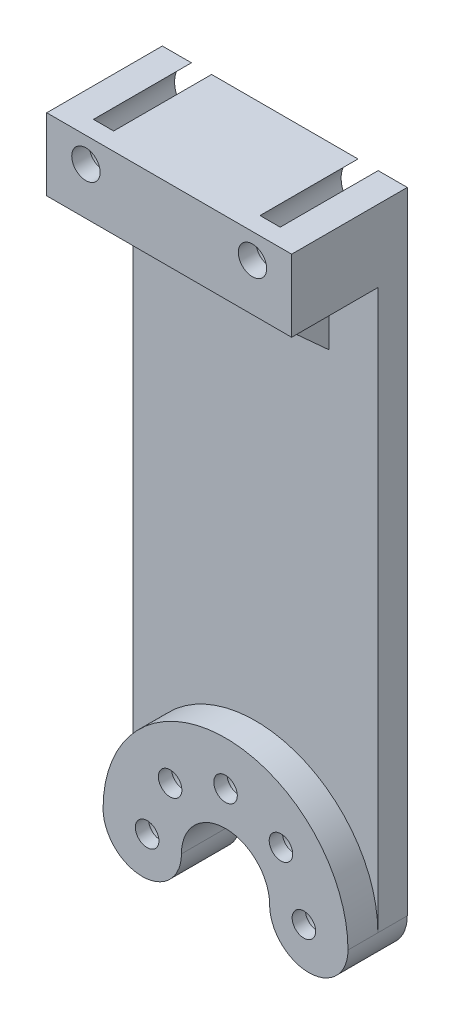
ISO-10303-21;
HEADER;
FILE_DESCRIPTION(('STEP AP214'),'2;1');
FILE_NAME('part.step','',(''),(''),'','','');
FILE_SCHEMA(('AUTOMOTIVE_DESIGN { 1 0 10303 214 1 1 1 1 }'));
ENDSEC;
DATA;
#1=APPLICATION_CONTEXT('core data for automotive mechanical design processes');
#2=APPLICATION_PROTOCOL_DEFINITION('international standard','automotive_design',2000,#1);
#3=PRODUCT_CONTEXT('',#1,'mechanical');
#4=PRODUCT('Part','Part','',(#3));
#5=PRODUCT_RELATED_PRODUCT_CATEGORY('part','',(#4));
#6=PRODUCT_DEFINITION_FORMATION('','',#4);
#7=PRODUCT_DEFINITION_CONTEXT('part definition',#1,'design');
#8=PRODUCT_DEFINITION('design','',#6,#7);
#9=PRODUCT_DEFINITION_SHAPE('','',#8);
#10=(LENGTH_UNIT() NAMED_UNIT(*) SI_UNIT(.MILLI.,.METRE.));
#11=(NAMED_UNIT(*) PLANE_ANGLE_UNIT() SI_UNIT($,.RADIAN.));
#12=(NAMED_UNIT(*) SI_UNIT($,.STERADIAN.) SOLID_ANGLE_UNIT());
#13=UNCERTAINTY_MEASURE_WITH_UNIT(LENGTH_MEASURE(1.E-05),#10,'distance_accuracy_value','');
#14=(GEOMETRIC_REPRESENTATION_CONTEXT(3) GLOBAL_UNCERTAINTY_ASSIGNED_CONTEXT((#13)) GLOBAL_UNIT_ASSIGNED_CONTEXT((#10,
#11,#12)) REPRESENTATION_CONTEXT('',''));
#15=CARTESIAN_POINT('',(0.,0.,0.));
#16=DIRECTION('',(0.,0.,1.));
#17=DIRECTION('',(1.,0.,0.));
#18=AXIS2_PLACEMENT_3D('',#15,#16,#17);
#19=CARTESIAN_POINT('',(0.,57.0382759986467,5.74999999999999));
#20=DIRECTION('',(0.,-0.739940073395942,0.672672793996315));
#21=DIRECTION('',(0.,-0.672672793996315,-0.739940073395942));
#22=AXIS2_PLACEMENT_3D('',#19,#20,#21);
#23=PLANE('',#22);
#24=DIRECTION('',(1.,0.,0.));
#25=VECTOR('',#24,1.);
#26=CARTESIAN_POINT('',(12.5000000000001,57.0382759986469,5.74999999999999));
#27=LINE('',#26,#25);
#28=CARTESIAN_POINT('',(4.4016250073337,57.0382759986467,5.74999999999999));
#29=VERTEX_POINT('',#28);
#30=CARTESIAN_POINT('',(7.5,57.0382759986469,5.74999999999999));
#31=VERTEX_POINT('',#30);
#32=EDGE_CURVE('E57',#29,#31,#27,.T.);
#33=ORIENTED_EDGE('',*,*,#32,.F.);
#34=DIRECTION('',(0.,0.672672793996315,0.739940073395942));
#35=VECTOR('',#34,1.);
#36=CARTESIAN_POINT('',(4.4016250073337,53.4188642339408,1.76864705882352));
#37=LINE('',#36,#35);
#38=CARTESIAN_POINT('',(4.4016250073337,49.0382759986469,-3.04999999999977));
#39=VERTEX_POINT('',#38);
#40=EDGE_CURVE('E169',#39,#29,#37,.T.);
#41=ORIENTED_EDGE('',*,*,#40,.F.);
#42=DIRECTION('',(-1.,0.,0.));
#43=VECTOR('',#42,1.);
#44=CARTESIAN_POINT('',(-8.50000000000002,49.0382759986469,-3.04999999999976));
#45=LINE('',#44,#43);
#46=CARTESIAN_POINT('',(7.5,49.0382759986469,-3.04999999999977));
#47=VERTEX_POINT('',#46);
#48=EDGE_CURVE('E178',#47,#39,#45,.T.);
#49=ORIENTED_EDGE('',*,*,#48,.F.);
#50=DIRECTION('',(0.,-0.672672793996315,-0.739940073395942));
#51=VECTOR('',#50,1.);
#52=CARTESIAN_POINT('',(7.5,57.0382759986467,5.74999999999999));
#53=LINE('',#52,#51);
#54=EDGE_CURVE('E436',#31,#47,#53,.T.);
#55=ORIENTED_EDGE('',*,*,#54,.F.);
#56=EDGE_LOOP('',(#33,#41,#49,#55));
#57=FACE_BOUND('',#56,.T.);
#58=ADVANCED_FACE('F34',(#57),#23,.T.);
#59=CARTESIAN_POINT('',(-4.53722944281639,49.0382759986469,-3.04999999999976));
#60=VERTEX_POINT('',#59);
#61=CARTESIAN_POINT('',(-7.5,49.0382759986469,-3.04999999999976));
#62=VERTEX_POINT('',#61);
#63=EDGE_CURVE('E186',#60,#62,#45,.T.);
#64=ORIENTED_EDGE('',*,*,#63,.F.);
#65=DIRECTION('',(0.,-0.672672793996315,-0.739940073395942));
#66=VECTOR('',#65,1.);
#67=CARTESIAN_POINT('',(-4.53722944281639,53.4188642339408,1.76864705882352));
#68=LINE('',#67,#66);
#69=CARTESIAN_POINT('',(-4.53722944281639,57.0382759986467,5.75));
#70=VERTEX_POINT('',#69);
#71=EDGE_CURVE('E49',#70,#60,#68,.T.);
#72=ORIENTED_EDGE('',*,*,#71,.F.);
#73=CARTESIAN_POINT('',(-7.5,57.0382759986467,5.75));
#74=VERTEX_POINT('',#73);
#75=EDGE_CURVE('E297',#74,#70,#27,.T.);
#76=ORIENTED_EDGE('',*,*,#75,.F.);
#77=DIRECTION('',(0.,-0.672672793996315,-0.739940073395942));
#78=VECTOR('',#77,1.);
#79=CARTESIAN_POINT('',(-7.5,57.0382759986467,5.74999999999999));
#80=LINE('',#79,#78);
#81=EDGE_CURVE('E433',#74,#62,#80,.T.);
#82=ORIENTED_EDGE('',*,*,#81,.T.);
#83=EDGE_LOOP('',(#64,#72,#76,#82));
#84=FACE_BOUND('',#83,.T.);
#85=ADVANCED_FACE('F432',(#84),#23,.T.);
#86=CARTESIAN_POINT('',(12.5000000000001,57.0382759986469,31.8080601733899));
#87=DIRECTION('',(0.,-1.,0.));
#88=DIRECTION('',(0.,0.,-1.));
#89=AXIS2_PLACEMENT_3D('',#86,#87,#88);
#90=PLANE('',#89);
#91=DIRECTION('',(-1.,0.,0.));
#92=VECTOR('',#91,1.);
#93=CARTESIAN_POINT('',(-8.50000000000004,57.0382759986469,-3.04999999999976));
#94=LINE('',#93,#92);
#95=CARTESIAN_POINT('',(-7.5,57.0382759986469,-3.04999999999977));
#96=VERTEX_POINT('',#95);
#97=CARTESIAN_POINT('',(-12.5000000000001,57.0382759986469,-3.04999999999976));
#98=VERTEX_POINT('',#97);
#99=EDGE_CURVE('E353',#96,#98,#94,.T.);
#100=ORIENTED_EDGE('',*,*,#99,.F.);
#101=DIRECTION('',(0.,0.,1.));
#102=VECTOR('',#101,1.);
#103=CARTESIAN_POINT('',(-7.5,57.0382759986469,31.8080601733899));
#104=LINE('',#103,#102);
#105=EDGE_CURVE('E424',#96,#74,#104,.T.);
#106=ORIENTED_EDGE('',*,*,#105,.T.);
#107=CARTESIAN_POINT('',(-12.5000000000001,57.0382759986469,5.74999999999999));
#108=VERTEX_POINT('',#107);
#109=EDGE_CURVE('E293',#108,#74,#27,.T.);
#110=ORIENTED_EDGE('',*,*,#109,.F.);
#111=DIRECTION('',(0.,0.,-1.));
#112=VECTOR('',#111,1.);
#113=CARTESIAN_POINT('',(-12.5000000000001,57.0382759986469,31.8080601733899));
#114=LINE('',#113,#112);
#115=EDGE_CURVE('E283',#108,#98,#114,.T.);
#116=ORIENTED_EDGE('',*,*,#115,.T.);
#117=EDGE_LOOP('',(#100,#106,#110,#116));
#118=FACE_BOUND('',#117,.T.);
#119=ADVANCED_FACE('F423',(#118),#90,.T.);
#120=CARTESIAN_POINT('',(4.25000000000002,0.,0.));
#121=DIRECTION('',(0.,0.,-1.));
#122=DIRECTION('',(-1.,0.,0.));
#123=AXIS2_PLACEMENT_3D('',#120,#121,#122);
#124=PLANE('',#123);
#125=CARTESIAN_POINT('',(8.,0.,0.));
#126=DIRECTION('',(0.,0.,-1.));
#127=DIRECTION('',(-1.,0.,0.));
#128=AXIS2_PLACEMENT_3D('',#125,#126,#127);
#129=CIRCLE('',#128,1.2);
#130=CARTESIAN_POINT('',(6.8,0.,0.));
#131=VERTEX_POINT('',#130);
#132=EDGE_CURVE('E200',#131,#131,#129,.T.);
#133=ORIENTED_EDGE('',*,*,#132,.T.);
#134=EDGE_LOOP('',(#133));
#135=FACE_BOUND('',#134,.T.);
#136=CARTESIAN_POINT('',(5.65685424949236,5.65685424949239,0.));
#137=DIRECTION('',(0.,0.,-1.));
#138=DIRECTION('',(-1.,0.,0.));
#139=AXIS2_PLACEMENT_3D('',#136,#137,#138);
#140=CIRCLE('',#139,1.2);
#141=CARTESIAN_POINT('',(4.45685424949236,5.65685424949239,0.));
#142=VERTEX_POINT('',#141);
#143=EDGE_CURVE('E212',#142,#142,#140,.T.);
#144=ORIENTED_EDGE('',*,*,#143,.T.);
#145=EDGE_LOOP('',(#144));
#146=FACE_BOUND('',#145,.T.);
#147=CARTESIAN_POINT('',(0.,8.,0.));
#148=DIRECTION('',(0.,0.,-1.));
#149=DIRECTION('',(-1.,0.,0.));
#150=AXIS2_PLACEMENT_3D('',#147,#148,#149);
#151=CIRCLE('',#150,1.2);
#152=CARTESIAN_POINT('',(-1.20000000000004,8.,0.));
#153=VERTEX_POINT('',#152);
#154=EDGE_CURVE('E224',#153,#153,#151,.T.);
#155=ORIENTED_EDGE('',*,*,#154,.T.);
#156=EDGE_LOOP('',(#155));
#157=FACE_BOUND('',#156,.T.);
#158=CARTESIAN_POINT('',(-5.65685424949242,5.65685424949235,0.));
#159=DIRECTION('',(0.,0.,-1.));
#160=DIRECTION('',(-1.,0.,0.));
#161=AXIS2_PLACEMENT_3D('',#158,#159,#160);
#162=CIRCLE('',#161,1.2);
#163=CARTESIAN_POINT('',(-6.85685424949242,5.65685424949235,0.));
#164=VERTEX_POINT('',#163);
#165=EDGE_CURVE('E236',#164,#164,#162,.T.);
#166=ORIENTED_EDGE('',*,*,#165,.T.);
#167=EDGE_LOOP('',(#166));
#168=FACE_BOUND('',#167,.T.);
#169=CARTESIAN_POINT('',(-8.,0.,0.));
#170=DIRECTION('',(0.,0.,-1.));
#171=DIRECTION('',(-1.,0.,0.));
#172=AXIS2_PLACEMENT_3D('',#169,#170,#171);
#173=CIRCLE('',#172,1.2);
#174=CARTESIAN_POINT('',(-9.2,0.,0.));
#175=VERTEX_POINT('',#174);
#176=EDGE_CURVE('E248',#175,#175,#173,.T.);
#177=ORIENTED_EDGE('',*,*,#176,.T.);
#178=EDGE_LOOP('',(#177));
#179=FACE_BOUND('',#178,.T.);
#180=CARTESIAN_POINT('',(8.50000000000004,0.,0.));
#181=DIRECTION('',(0.,0.,1.));
#182=DIRECTION('',(-1.,0.,0.));
#183=AXIS2_PLACEMENT_3D('',#180,#181,#182);
#184=CIRCLE('',#183,4.00000000000004);
#185=CARTESIAN_POINT('',(4.5,0.,0.));
#186=VERTEX_POINT('',#185);
#187=CARTESIAN_POINT('',(12.5000000000001,0.,0.));
#188=VERTEX_POINT('',#187);
#189=EDGE_CURVE('E330',#186,#188,#184,.T.);
#190=ORIENTED_EDGE('',*,*,#189,.T.);
#191=CARTESIAN_POINT('',(0.,0.,0.));
#192=DIRECTION('',(0.,0.,1.));
#193=DIRECTION('',(1.,0.,0.));
#194=AXIS2_PLACEMENT_3D('',#191,#192,#193);
#195=CIRCLE('',#194,12.5000000000001);
#196=CARTESIAN_POINT('',(-12.5000000000001,0.,0.));
#197=VERTEX_POINT('',#196);
#198=EDGE_CURVE('E338',#188,#197,#195,.T.);
#199=ORIENTED_EDGE('',*,*,#198,.T.);
#200=CARTESIAN_POINT('',(-8.50000000000004,0.,0.));
#201=DIRECTION('',(0.,0.,1.));
#202=DIRECTION('',(-1.,0.,0.));
#203=AXIS2_PLACEMENT_3D('',#200,#201,#202);
#204=CIRCLE('',#203,4.00000000000004);
#205=CARTESIAN_POINT('',(-4.5,0.,0.));
#206=VERTEX_POINT('',#205);
#207=EDGE_CURVE('E335',#197,#206,#204,.T.);
#208=ORIENTED_EDGE('',*,*,#207,.T.);
#209=CARTESIAN_POINT('',(0.,0.,0.));
#210=DIRECTION('',(0.,0.,-1.));
#211=DIRECTION('',(1.,0.,0.));
#212=AXIS2_PLACEMENT_3D('',#209,#210,#211);
#213=CIRCLE('',#212,4.5);
#214=EDGE_CURVE('E331',#206,#186,#213,.T.);
#215=ORIENTED_EDGE('',*,*,#214,.T.);
#216=EDGE_LOOP('',(#190,#199,#208,#215));
#217=FACE_BOUND('',#216,.T.);
#218=ADVANCED_FACE('F414',(#135,#146,#157,#168,#179,#217),#124,.F.);
#219=CARTESIAN_POINT('',(0.,0.,-35.0041316015003));
#220=DIRECTION('',(0.,0.,1.));
#221=DIRECTION('',(1.,0.,0.));
#222=AXIS2_PLACEMENT_3D('',#219,#220,#221);
#223=CYLINDRICAL_SURFACE('',#222,12.5000000000001);
#224=DIRECTION('',(0.,0.,1.));
#225=VECTOR('',#224,1.);
#226=CARTESIAN_POINT('',(12.5000000000001,0.,-35.0041316015003));
#227=LINE('',#226,#225);
#228=CARTESIAN_POINT('',(12.5000000000001,0.,-3.04999999999977));
#229=VERTEX_POINT('',#228);
#230=EDGE_CURVE('E348',#229,#188,#227,.T.);
#231=ORIENTED_EDGE('',*,*,#230,.F.);
#232=CARTESIAN_POINT('',(0.,0.,-3.04999999999977));
#233=DIRECTION('',(0.,0.,-1.));
#234=DIRECTION('',(-1.,0.,0.));
#235=AXIS2_PLACEMENT_3D('',#232,#233,#234);
#236=CIRCLE('',#235,12.5000000000001);
#237=CARTESIAN_POINT('',(-12.5000000000001,0.,-3.04999999999976));
#238=VERTEX_POINT('',#237);
#239=EDGE_CURVE('E334',#229,#238,#236,.F.);
#240=ORIENTED_EDGE('',*,*,#239,.T.);
#241=DIRECTION('',(0.,0.,1.));
#242=VECTOR('',#241,1.);
#243=CARTESIAN_POINT('',(-12.5000000000001,0.,-35.0041316015003));
#244=LINE('',#243,#242);
#245=EDGE_CURVE('E345',#238,#197,#244,.T.);
#246=ORIENTED_EDGE('',*,*,#245,.T.);
#247=ORIENTED_EDGE('',*,*,#198,.F.);
#248=EDGE_LOOP('',(#231,#240,#246,#247));
#249=FACE_BOUND('',#248,.T.);
#250=ADVANCED_FACE('F36',(#249),#223,.T.);
#251=CARTESIAN_POINT('',(-8.50000000000004,0.,-35.0041316015003));
#252=DIRECTION('',(0.,0.,1.));
#253=DIRECTION('',(1.,0.,0.));
#254=AXIS2_PLACEMENT_3D('',#251,#252,#253);
#255=CYLINDRICAL_SURFACE('',#254,4.00000000000004);
#256=ORIENTED_EDGE('',*,*,#245,.F.);
#257=DIRECTION('',(0.,0.,1.));
#258=VECTOR('',#257,1.);
#259=CARTESIAN_POINT('',(-12.5000000000001,0.,-6.04999999999976));
#260=LINE('',#259,#258);
#261=CARTESIAN_POINT('',(-12.5000000000001,0.,-6.04999999999976));
#262=VERTEX_POINT('',#261);
#263=EDGE_CURVE('E328',#262,#238,#260,.T.);
#264=ORIENTED_EDGE('',*,*,#263,.F.);
#265=CARTESIAN_POINT('',(-8.50000000000005,0.,-6.04999999999976));
#266=DIRECTION('',(0.,0.,-1.));
#267=DIRECTION('',(-1.,0.,0.));
#268=AXIS2_PLACEMENT_3D('',#265,#266,#267);
#269=CIRCLE('',#268,4.00000000000004);
#270=CARTESIAN_POINT('',(-4.50000000000001,0.,-6.04999999999976));
#271=VERTEX_POINT('',#270);
#272=EDGE_CURVE('E298',#271,#262,#269,.T.);
#273=ORIENTED_EDGE('',*,*,#272,.F.);
#274=DIRECTION('',(0.,0.,1.));
#275=VECTOR('',#274,1.);
#276=CARTESIAN_POINT('',(-4.5,0.,-35.0041316015003));
#277=LINE('',#276,#275);
#278=EDGE_CURVE('E349',#271,#206,#277,.T.);
#279=ORIENTED_EDGE('',*,*,#278,.T.);
#280=ORIENTED_EDGE('',*,*,#207,.F.);
#281=EDGE_LOOP('',(#256,#264,#273,#279,#280));
#282=FACE_BOUND('',#281,.T.);
#283=ADVANCED_FACE('F412',(#282),#255,.T.);
#284=CARTESIAN_POINT('',(0.,0.,-35.0041316015003));
#285=DIRECTION('',(0.,0.,1.));
#286=DIRECTION('',(1.,0.,0.));
#287=AXIS2_PLACEMENT_3D('',#284,#285,#286);
#288=CYLINDRICAL_SURFACE('',#287,4.5);
#289=ORIENTED_EDGE('',*,*,#278,.F.);
#290=CARTESIAN_POINT('',(0.,0.,-6.04999999999976));
#291=DIRECTION('',(0.,0.,1.));
#292=DIRECTION('',(-1.,0.,0.));
#293=AXIS2_PLACEMENT_3D('',#290,#291,#292);
#294=CIRCLE('',#293,4.5);
#295=CARTESIAN_POINT('',(4.5,0.,-6.04999999999977));
#296=VERTEX_POINT('',#295);
#297=EDGE_CURVE('E314',#296,#271,#294,.T.);
#298=ORIENTED_EDGE('',*,*,#297,.F.);
#299=DIRECTION('',(0.,0.,1.));
#300=VECTOR('',#299,1.);
#301=CARTESIAN_POINT('',(4.5,0.,-35.0041316015003));
#302=LINE('',#301,#300);
#303=EDGE_CURVE('E346',#296,#186,#302,.T.);
#304=ORIENTED_EDGE('',*,*,#303,.T.);
#305=ORIENTED_EDGE('',*,*,#214,.F.);
#306=EDGE_LOOP('',(#289,#298,#304,#305));
#307=FACE_BOUND('',#306,.T.);
#308=ADVANCED_FACE('F407',(#307),#288,.F.);
#309=CARTESIAN_POINT('',(8.50000000000004,0.,-35.0041316015003));
#310=DIRECTION('',(0.,0.,1.));
#311=DIRECTION('',(1.,0.,0.));
#312=AXIS2_PLACEMENT_3D('',#309,#310,#311);
#313=CYLINDRICAL_SURFACE('',#312,4.00000000000004);
#314=ORIENTED_EDGE('',*,*,#303,.F.);
#315=CARTESIAN_POINT('',(8.50000000000004,0.,-6.04999999999977));
#316=DIRECTION('',(0.,0.,-1.));
#317=DIRECTION('',(-1.,0.,0.));
#318=AXIS2_PLACEMENT_3D('',#315,#316,#317);
#319=CIRCLE('',#318,4.00000000000004);
#320=CARTESIAN_POINT('',(12.5000000000001,0.,-6.04999999999977));
#321=VERTEX_POINT('',#320);
#322=EDGE_CURVE('E311',#321,#296,#319,.T.);
#323=ORIENTED_EDGE('',*,*,#322,.F.);
#324=DIRECTION('',(0.,0.,1.));
#325=VECTOR('',#324,1.);
#326=CARTESIAN_POINT('',(12.5000000000001,0.,-6.04999999999977));
#327=LINE('',#326,#325);
#328=EDGE_CURVE('E317',#321,#229,#327,.T.);
#329=ORIENTED_EDGE('',*,*,#328,.T.);
#330=ORIENTED_EDGE('',*,*,#230,.T.);
#331=ORIENTED_EDGE('',*,*,#189,.F.);
#332=EDGE_LOOP('',(#314,#323,#329,#330,#331));
#333=FACE_BOUND('',#332,.T.);
#334=ADVANCED_FACE('F403',(#333),#313,.T.);
#335=CARTESIAN_POINT('',(-12.5000000000001,64.3882759986469,-6.04999999999976));
#336=DIRECTION('',(1.,0.,0.));
#337=DIRECTION('',(0.,0.,-1.));
#338=AXIS2_PLACEMENT_3D('',#335,#336,#337);
#339=PLANE('',#338);
#340=DIRECTION('',(0.,1.,0.));
#341=VECTOR('',#340,1.);
#342=CARTESIAN_POINT('',(-12.5000000000001,64.3882759986469,-3.04999999999976));
#343=LINE('',#342,#341);
#344=EDGE_CURVE('E296',#238,#98,#343,.T.);
#345=ORIENTED_EDGE('',*,*,#344,.T.);
#346=ORIENTED_EDGE('',*,*,#115,.F.);
#347=DIRECTION('',(0.,-1.,0.));
#348=VECTOR('',#347,1.);
#349=CARTESIAN_POINT('',(-12.5000000000001,64.3882759986469,5.75));
#350=LINE('',#349,#348);
#351=CARTESIAN_POINT('',(-12.5000000000001,64.3882759986469,5.75));
#352=VERTEX_POINT('',#351);
#353=EDGE_CURVE('E280',#352,#108,#350,.T.);
#354=ORIENTED_EDGE('',*,*,#353,.F.);
#355=DIRECTION('',(0.,0.,1.));
#356=VECTOR('',#355,1.);
#357=CARTESIAN_POINT('',(-12.5000000000001,64.3882759986469,-6.04999999999976));
#358=LINE('',#357,#356);
#359=CARTESIAN_POINT('',(-12.5000000000001,64.3882759986469,-6.04999999999976));
#360=VERTEX_POINT('',#359);
#361=EDGE_CURVE('E325',#360,#352,#358,.T.);
#362=ORIENTED_EDGE('',*,*,#361,.F.);
#363=DIRECTION('',(0.,1.,0.));
#364=VECTOR('',#363,1.);
#365=CARTESIAN_POINT('',(-12.5000000000001,64.3882759986469,-6.04999999999976));
#366=LINE('',#365,#364);
#367=EDGE_CURVE('E301',#262,#360,#366,.T.);
#368=ORIENTED_EDGE('',*,*,#367,.F.);
#369=ORIENTED_EDGE('',*,*,#263,.T.);
#370=EDGE_LOOP('',(#345,#346,#354,#362,#368,#369));
#371=FACE_BOUND('',#370,.T.);
#372=ADVANCED_FACE('F378',(#371),#339,.F.);
#373=CARTESIAN_POINT('',(12.5000000000001,64.3882759986469,-6.04999999999978));
#374=DIRECTION('',(0.,-1.,0.));
#375=DIRECTION('',(0.,0.,-1.));
#376=AXIS2_PLACEMENT_3D('',#373,#374,#375);
#377=PLANE('',#376);
#378=DIRECTION('',(-1.,0.,0.));
#379=VECTOR('',#378,1.);
#380=CARTESIAN_POINT('',(12.5000000000001,64.3882759986469,3.95000000000023));
#381=LINE('',#380,#379);
#382=CARTESIAN_POINT('',(9.52956301409877,64.3882759986469,3.95000000000023));
#383=VERTEX_POINT('',#382);
#384=CARTESIAN_POINT('',(7.47043698590137,64.3882759986469,3.95000000000023));
#385=VERTEX_POINT('',#384);
#386=EDGE_CURVE('E11',#383,#385,#381,.T.);
#387=ORIENTED_EDGE('',*,*,#386,.T.);
#388=DIRECTION('',(0.,0.,-1.));
#389=VECTOR('',#388,1.);
#390=CARTESIAN_POINT('',(7.47043698590137,64.3882759986469,-6.04999999999977));
#391=LINE('',#390,#389);
#392=CARTESIAN_POINT('',(7.47043698590137,64.3882759986469,-6.04999999999977));
#393=VERTEX_POINT('',#392);
#394=EDGE_CURVE('E265',#385,#393,#391,.T.);
#395=ORIENTED_EDGE('',*,*,#394,.T.);
#396=DIRECTION('',(1.,0.,0.));
#397=VECTOR('',#396,1.);
#398=CARTESIAN_POINT('',(12.5000000000001,64.3882759986469,-6.04999999999978));
#399=LINE('',#398,#397);
#400=CARTESIAN_POINT('',(-7.47043698590122,64.3882759986469,-6.04999999999976));
#401=VERTEX_POINT('',#400);
#402=EDGE_CURVE('E309',#401,#393,#399,.T.);
#403=ORIENTED_EDGE('',*,*,#402,.F.);
#404=DIRECTION('',(0.,0.,-1.));
#405=VECTOR('',#404,1.);
#406=CARTESIAN_POINT('',(-7.47043698590122,64.3882759986469,-6.04999999999976));
#407=LINE('',#406,#405);
#408=CARTESIAN_POINT('',(-7.47043698590122,64.3882759986469,3.95000000000024));
#409=VERTEX_POINT('',#408);
#410=EDGE_CURVE('E356',#401,#409,#407,.F.);
#411=ORIENTED_EDGE('',*,*,#410,.T.);
#412=DIRECTION('',(-1.,0.,0.));
#413=VECTOR('',#412,1.);
#414=CARTESIAN_POINT('',(12.5000000000001,64.3882759986469,3.95000000000024));
#415=LINE('',#414,#413);
#416=CARTESIAN_POINT('',(-9.52956301409863,64.3882759986469,3.95000000000024));
#417=VERTEX_POINT('',#416);
#418=EDGE_CURVE('E359',#409,#417,#415,.T.);
#419=ORIENTED_EDGE('',*,*,#418,.T.);
#420=DIRECTION('',(0.,0.,-1.));
#421=VECTOR('',#420,1.);
#422=CARTESIAN_POINT('',(-9.52956301409863,64.3882759986469,-6.04999999999976));
#423=LINE('',#422,#421);
#424=CARTESIAN_POINT('',(-9.52956301409863,64.3882759986469,-6.04999999999976));
#425=VERTEX_POINT('',#424);
#426=EDGE_CURVE('E42',#417,#425,#423,.T.);
#427=ORIENTED_EDGE('',*,*,#426,.T.);
#428=EDGE_CURVE('E305',#360,#425,#399,.T.);
#429=ORIENTED_EDGE('',*,*,#428,.F.);
#430=ORIENTED_EDGE('',*,*,#361,.T.);
#431=DIRECTION('',(-1.,0.,0.));
#432=VECTOR('',#431,1.);
#433=CARTESIAN_POINT('',(12.5000000000001,64.3882759986469,5.74999999999999));
#434=LINE('',#433,#432);
#435=CARTESIAN_POINT('',(12.5000000000001,64.3882759986469,5.74999999999999));
#436=VERTEX_POINT('',#435);
#437=EDGE_CURVE('E282',#436,#352,#434,.T.);
#438=ORIENTED_EDGE('',*,*,#437,.F.);
#439=DIRECTION('',(0.,0.,1.));
#440=VECTOR('',#439,1.);
#441=CARTESIAN_POINT('',(12.5000000000001,64.3882759986469,-6.04999999999978));
#442=LINE('',#441,#440);
#443=CARTESIAN_POINT('',(12.5000000000001,64.3882759986469,-6.04999999999978));
#444=VERTEX_POINT('',#443);
#445=EDGE_CURVE('E323',#444,#436,#442,.T.);
#446=ORIENTED_EDGE('',*,*,#445,.F.);
#447=CARTESIAN_POINT('',(9.52956301409878,64.3882759986469,-6.04999999999977));
#448=VERTEX_POINT('',#447);
#449=EDGE_CURVE('E304',#448,#444,#399,.T.);
#450=ORIENTED_EDGE('',*,*,#449,.F.);
#451=DIRECTION('',(0.,0.,-1.));
#452=VECTOR('',#451,1.);
#453=CARTESIAN_POINT('',(9.52956301409878,64.3882759986469,-6.04999999999977));
#454=LINE('',#453,#452);
#455=EDGE_CURVE('E262',#448,#383,#454,.F.);
#456=ORIENTED_EDGE('',*,*,#455,.T.);
#457=EDGE_LOOP('',(#387,#395,#403,#411,#419,#427,#429,#430,#438,#446,#450,#456));
#458=FACE_BOUND('',#457,.T.);
#459=ADVANCED_FACE('F364',(#458),#377,.F.);
#460=CARTESIAN_POINT('',(12.5000000000001,64.3882759986469,-6.04999999999978));
#461=DIRECTION('',(-1.,0.,0.));
#462=DIRECTION('',(0.,0.,1.));
#463=AXIS2_PLACEMENT_3D('',#460,#461,#462);
#464=PLANE('',#463);
#465=ORIENTED_EDGE('',*,*,#328,.F.);
#466=DIRECTION('',(0.,-1.,0.));
#467=VECTOR('',#466,1.);
#468=CARTESIAN_POINT('',(12.5000000000001,64.3882759986469,-6.04999999999978));
#469=LINE('',#468,#467);
#470=EDGE_CURVE('E308',#444,#321,#469,.T.);
#471=ORIENTED_EDGE('',*,*,#470,.F.);
#472=ORIENTED_EDGE('',*,*,#445,.T.);
#473=DIRECTION('',(0.,1.,0.));
#474=VECTOR('',#473,1.);
#475=CARTESIAN_POINT('',(12.5000000000001,64.3882759986469,5.74999999999999));
#476=LINE('',#475,#474);
#477=CARTESIAN_POINT('',(12.5000000000001,57.0382759986469,5.74999999999999));
#478=VERTEX_POINT('',#477);
#479=EDGE_CURVE('E285',#478,#436,#476,.T.);
#480=ORIENTED_EDGE('',*,*,#479,.F.);
#481=DIRECTION('',(0.,0.,-1.));
#482=VECTOR('',#481,1.);
#483=CARTESIAN_POINT('',(12.5000000000001,57.0382759986469,31.8080601733899));
#484=LINE('',#483,#482);
#485=CARTESIAN_POINT('',(12.5000000000001,57.0382759986469,-3.04999999999977));
#486=VERTEX_POINT('',#485);
#487=EDGE_CURVE('E279',#478,#486,#484,.T.);
#488=ORIENTED_EDGE('',*,*,#487,.T.);
#489=DIRECTION('',(0.,-1.,0.));
#490=VECTOR('',#489,1.);
#491=CARTESIAN_POINT('',(12.5000000000001,64.3882759986469,-3.04999999999978));
#492=LINE('',#491,#490);
#493=EDGE_CURVE('E302',#486,#229,#492,.T.);
#494=ORIENTED_EDGE('',*,*,#493,.T.);
#495=EDGE_LOOP('',(#465,#471,#472,#480,#488,#494));
#496=FACE_BOUND('',#495,.T.);
#497=ADVANCED_FACE('F391',(#496),#464,.F.);
#498=CARTESIAN_POINT('',(-8.50000000000005,0.,-6.04999999999976));
#499=DIRECTION('',(0.,0.,-1.));
#500=DIRECTION('',(-1.,0.,0.));
#501=AXIS2_PLACEMENT_3D('',#498,#499,#500);
#502=PLANE('',#501);
#503=ORIENTED_EDGE('',*,*,#402,.T.);
#504=CARTESIAN_POINT('',(8.50000000000007,61.8382759986469,-6.04999999999977));
#505=DIRECTION('',(0.,0.,-1.));
#506=DIRECTION('',(0.,1.,0.));
#507=AXIS2_PLACEMENT_3D('',#504,#505,#506);
#508=CIRCLE('',#507,2.75);
#509=EDGE_CURVE('E251',#448,#393,#508,.T.);
#510=ORIENTED_EDGE('',*,*,#509,.F.);
#511=ORIENTED_EDGE('',*,*,#449,.T.);
#512=ORIENTED_EDGE('',*,*,#470,.T.);
#513=ORIENTED_EDGE('',*,*,#322,.T.);
#514=ORIENTED_EDGE('',*,*,#297,.T.);
#515=ORIENTED_EDGE('',*,*,#272,.T.);
#516=ORIENTED_EDGE('',*,*,#367,.T.);
#517=ORIENTED_EDGE('',*,*,#428,.T.);
#518=CARTESIAN_POINT('',(-8.49999999999993,61.8382759986469,-6.04999999999976));
#519=DIRECTION('',(0.,0.,-1.));
#520=DIRECTION('',(0.,1.,0.));
#521=AXIS2_PLACEMENT_3D('',#518,#519,#520);
#522=CIRCLE('',#521,2.75);
#523=EDGE_CURVE('E268',#401,#425,#522,.T.);
#524=ORIENTED_EDGE('',*,*,#523,.F.);
#525=EDGE_LOOP('',(#503,#510,#511,#512,#513,#514,#515,#516,#517,#524));
#526=FACE_BOUND('',#525,.T.);
#527=CARTESIAN_POINT('',(8.,0.,-6.04999999999977));
#528=DIRECTION('',(0.,0.,-1.));
#529=DIRECTION('',(0.,1.,0.));
#530=AXIS2_PLACEMENT_3D('',#527,#528,#529);
#531=CIRCLE('',#530,2.2);
#532=CARTESIAN_POINT('',(8.,2.2,-6.04999999999977));
#533=VERTEX_POINT('',#532);
#534=EDGE_CURVE('E185',#533,#533,#531,.T.);
#535=ORIENTED_EDGE('',*,*,#534,.F.);
#536=EDGE_LOOP('',(#535));
#537=FACE_BOUND('',#536,.T.);
#538=CARTESIAN_POINT('',(5.65685424949236,5.65685424949239,-6.04999999999977));
#539=DIRECTION('',(0.,0.,-1.));
#540=DIRECTION('',(0.,1.,0.));
#541=AXIS2_PLACEMENT_3D('',#538,#539,#540);
#542=CIRCLE('',#541,2.2);
#543=CARTESIAN_POINT('',(5.65685424949236,7.85685424949239,-6.04999999999977));
#544=VERTEX_POINT('',#543);
#545=EDGE_CURVE('E203',#544,#544,#542,.T.);
#546=ORIENTED_EDGE('',*,*,#545,.F.);
#547=EDGE_LOOP('',(#546));
#548=FACE_BOUND('',#547,.T.);
#549=CARTESIAN_POINT('',(0.,8.,-6.04999999999976));
#550=DIRECTION('',(0.,0.,-1.));
#551=DIRECTION('',(0.,1.,0.));
#552=AXIS2_PLACEMENT_3D('',#549,#550,#551);
#553=CIRCLE('',#552,2.2);
#554=CARTESIAN_POINT('',(0.,10.2,-6.04999999999976));
#555=VERTEX_POINT('',#554);
#556=EDGE_CURVE('E215',#555,#555,#553,.T.);
#557=ORIENTED_EDGE('',*,*,#556,.F.);
#558=EDGE_LOOP('',(#557));
#559=FACE_BOUND('',#558,.T.);
#560=CARTESIAN_POINT('',(-5.65685424949242,5.65685424949235,-6.04999999999976));
#561=DIRECTION('',(0.,0.,-1.));
#562=DIRECTION('',(0.,1.,0.));
#563=AXIS2_PLACEMENT_3D('',#560,#561,#562);
#564=CIRCLE('',#563,2.2);
#565=CARTESIAN_POINT('',(-5.65685424949242,7.85685424949235,-6.04999999999976));
#566=VERTEX_POINT('',#565);
#567=EDGE_CURVE('E227',#566,#566,#564,.T.);
#568=ORIENTED_EDGE('',*,*,#567,.F.);
#569=EDGE_LOOP('',(#568));
#570=FACE_BOUND('',#569,.T.);
#571=CARTESIAN_POINT('',(-8.,0.,-6.04999999999976));
#572=DIRECTION('',(0.,0.,-1.));
#573=DIRECTION('',(0.,1.,0.));
#574=AXIS2_PLACEMENT_3D('',#571,#572,#573);
#575=CIRCLE('',#574,2.2);
#576=CARTESIAN_POINT('',(-8.,2.19999999999994,-6.04999999999976));
#577=VERTEX_POINT('',#576);
#578=EDGE_CURVE('E239',#577,#577,#575,.T.);
#579=ORIENTED_EDGE('',*,*,#578,.F.);
#580=EDGE_LOOP('',(#579));
#581=FACE_BOUND('',#580,.T.);
#582=ADVANCED_FACE('F370',(#526,#537,#548,#559,#570,#581),#502,.T.);
#583=CARTESIAN_POINT('',(-8.50000000000004,0.,-3.04999999999976));
#584=DIRECTION('',(0.,0.,-1.));
#585=DIRECTION('',(-1.,0.,0.));
#586=AXIS2_PLACEMENT_3D('',#583,#584,#585);
#587=PLANE('',#586);
#588=CARTESIAN_POINT('',(7.5,57.0382759986469,-3.04999999999977));
#589=VERTEX_POINT('',#588);
#590=EDGE_CURVE('E354',#486,#589,#94,.T.);
#591=ORIENTED_EDGE('',*,*,#590,.T.);
#592=DIRECTION('',(0.,-1.,0.));
#593=VECTOR('',#592,1.);
#594=CARTESIAN_POINT('',(7.5,0.,-3.04999999999977));
#595=LINE('',#594,#593);
#596=EDGE_CURVE('E184',#589,#47,#595,.T.);
#597=ORIENTED_EDGE('',*,*,#596,.T.);
#598=ORIENTED_EDGE('',*,*,#48,.T.);
#599=DIRECTION('',(0.,1.,0.));
#600=VECTOR('',#599,1.);
#601=CARTESIAN_POINT('',(4.4016250073337,49.0382759986467,-3.04999999999976));
#602=LINE('',#601,#600);
#603=CARTESIAN_POINT('',(4.4016250073337,57.0382759986467,-3.04999999999976));
#604=VERTEX_POINT('',#603);
#605=EDGE_CURVE('E166',#39,#604,#602,.T.);
#606=ORIENTED_EDGE('',*,*,#605,.T.);
#607=DIRECTION('',(-1.,0.,0.));
#608=VECTOR('',#607,1.);
#609=CARTESIAN_POINT('',(4.4016250073337,57.0382759986467,-3.04999999999976));
#610=LINE('',#609,#608);
#611=CARTESIAN_POINT('',(-4.53722944281639,57.0382759986467,-3.04999999999976));
#612=VERTEX_POINT('',#611);
#613=EDGE_CURVE('E175',#604,#612,#610,.T.);
#614=ORIENTED_EDGE('',*,*,#613,.T.);
#615=DIRECTION('',(0.,-1.,0.));
#616=VECTOR('',#615,1.);
#617=CARTESIAN_POINT('',(-4.53722944281639,49.0382759986467,-3.04999999999976));
#618=LINE('',#617,#616);
#619=EDGE_CURVE('E637',#612,#60,#618,.T.);
#620=ORIENTED_EDGE('',*,*,#619,.T.);
#621=ORIENTED_EDGE('',*,*,#63,.T.);
#622=DIRECTION('',(0.,-1.,0.));
#623=VECTOR('',#622,1.);
#624=CARTESIAN_POINT('',(-7.5,0.,-3.04999999999976));
#625=LINE('',#624,#623);
#626=EDGE_CURVE('E191',#96,#62,#625,.T.);
#627=ORIENTED_EDGE('',*,*,#626,.F.);
#628=ORIENTED_EDGE('',*,*,#99,.T.);
#629=ORIENTED_EDGE('',*,*,#344,.F.);
#630=ORIENTED_EDGE('',*,*,#239,.F.);
#631=ORIENTED_EDGE('',*,*,#493,.F.);
#632=EDGE_LOOP('',(#591,#597,#598,#606,#614,#620,#621,#627,#628,#629,#630,#631));
#633=FACE_BOUND('',#632,.T.);
#634=ADVANCED_FACE('F183',(#633),#587,.F.);
#635=DIRECTION('',(0.,0.,1.));
#636=VECTOR('',#635,1.);
#637=CARTESIAN_POINT('',(7.5,57.0382759986469,31.8080601733899));
#638=LINE('',#637,#636);
#639=EDGE_CURVE('E397',#589,#31,#638,.T.);
#640=ORIENTED_EDGE('',*,*,#639,.F.);
#641=ORIENTED_EDGE('',*,*,#590,.F.);
#642=ORIENTED_EDGE('',*,*,#487,.F.);
#643=EDGE_CURVE('E288',#31,#478,#27,.T.);
#644=ORIENTED_EDGE('',*,*,#643,.F.);
#645=EDGE_LOOP('',(#640,#641,#642,#644));
#646=FACE_BOUND('',#645,.T.);
#647=ADVANCED_FACE('F395',(#646),#90,.T.);
#648=CARTESIAN_POINT('',(18.5120000000001,58.0262759986469,5.74999999999999));
#649=DIRECTION('',(0.,0.,-1.));
#650=DIRECTION('',(-1.,0.,0.));
#651=AXIS2_PLACEMENT_3D('',#648,#649,#650);
#652=PLANE('',#651);
#653=CARTESIAN_POINT('',(8.50000000000007,61.8382759986469,5.74999999999999));
#654=DIRECTION('',(0.,0.,-1.));
#655=DIRECTION('',(-1.,0.,0.));
#656=AXIS2_PLACEMENT_3D('',#653,#654,#655);
#657=CIRCLE('',#656,1.45);
#658=CARTESIAN_POINT('',(7.05000000000008,61.8382759986469,5.74999999999999));
#659=VERTEX_POINT('',#658);
#660=EDGE_CURVE('E259',#659,#659,#657,.T.);
#661=ORIENTED_EDGE('',*,*,#660,.T.);
#662=EDGE_LOOP('',(#661));
#663=FACE_BOUND('',#662,.T.);
#664=ORIENTED_EDGE('',*,*,#437,.T.);
#665=ORIENTED_EDGE('',*,*,#353,.T.);
#666=ORIENTED_EDGE('',*,*,#109,.T.);
#667=ORIENTED_EDGE('',*,*,#75,.T.);
#668=DIRECTION('',(1.,0.,0.));
#669=VECTOR('',#668,1.);
#670=CARTESIAN_POINT('',(12.5000000000001,57.0382759986469,5.74999999999999));
#671=LINE('',#670,#669);
#672=EDGE_CURVE('E427',#70,#29,#671,.T.);
#673=ORIENTED_EDGE('',*,*,#672,.T.);
#674=ORIENTED_EDGE('',*,*,#32,.T.);
#675=ORIENTED_EDGE('',*,*,#643,.T.);
#676=ORIENTED_EDGE('',*,*,#479,.T.);
#677=EDGE_LOOP('',(#664,#665,#666,#667,#673,#674,#675,#676));
#678=FACE_BOUND('',#677,.T.);
#679=CARTESIAN_POINT('',(-8.49999999999993,61.8382759986469,5.75));
#680=DIRECTION('',(0.,0.,-1.));
#681=DIRECTION('',(-1.,0.,0.));
#682=AXIS2_PLACEMENT_3D('',#679,#680,#681);
#683=CIRCLE('',#682,1.45);
#684=CARTESIAN_POINT('',(-9.94999999999992,61.8382759986469,5.75));
#685=VERTEX_POINT('',#684);
#686=EDGE_CURVE('E276',#685,#685,#683,.T.);
#687=ORIENTED_EDGE('',*,*,#686,.T.);
#688=EDGE_LOOP('',(#687));
#689=FACE_BOUND('',#688,.T.);
#690=ADVANCED_FACE('F384',(#663,#678,#689),#652,.F.);
#691=CARTESIAN_POINT('',(-7.04999999999993,61.8382759986469,3.95000000000024));
#692=DIRECTION('',(0.,0.,1.));
#693=DIRECTION('',(0.,-1.,0.));
#694=AXIS2_PLACEMENT_3D('',#691,#692,#693);
#695=PLANE('',#694);
#696=CARTESIAN_POINT('',(-8.49999999999993,61.8382759986469,3.95000000000024));
#697=DIRECTION('',(0.,0.,-1.));
#698=DIRECTION('',(0.,1.,0.));
#699=AXIS2_PLACEMENT_3D('',#696,#697,#698);
#700=CIRCLE('',#699,1.45);
#701=CARTESIAN_POINT('',(-8.49999999999993,63.2882759986469,3.95000000000024));
#702=VERTEX_POINT('',#701);
#703=EDGE_CURVE('E273',#702,#702,#700,.T.);
#704=ORIENTED_EDGE('',*,*,#703,.F.);
#705=EDGE_LOOP('',(#704));
#706=FACE_BOUND('',#705,.T.);
#707=CARTESIAN_POINT('',(-8.49999999999993,61.8382759986469,3.95000000000024));
#708=DIRECTION('',(0.,0.,-1.));
#709=DIRECTION('',(0.,1.,0.));
#710=AXIS2_PLACEMENT_3D('',#707,#708,#709);
#711=CIRCLE('',#710,2.75);
#712=EDGE_CURVE('E270',#409,#417,#711,.T.);
#713=ORIENTED_EDGE('',*,*,#712,.T.);
#714=ORIENTED_EDGE('',*,*,#418,.F.);
#715=EDGE_LOOP('',(#713,#714));
#716=FACE_BOUND('',#715,.T.);
#717=ADVANCED_FACE('F536',(#706,#716),#695,.F.);
#718=CARTESIAN_POINT('',(-8.49999999999993,61.8382759986469,-6.04999999999976));
#719=DIRECTION('',(0.,0.,-1.));
#720=DIRECTION('',(0.,1.,0.));
#721=AXIS2_PLACEMENT_3D('',#718,#719,#720);
#722=CYLINDRICAL_SURFACE('',#721,2.75);
#723=ORIENTED_EDGE('',*,*,#523,.T.);
#724=ORIENTED_EDGE('',*,*,#426,.F.);
#725=ORIENTED_EDGE('',*,*,#712,.F.);
#726=ORIENTED_EDGE('',*,*,#410,.F.);
#727=EDGE_LOOP('',(#723,#724,#725,#726));
#728=FACE_BOUND('',#727,.T.);
#729=ADVANCED_FACE('F533',(#728),#722,.F.);
#730=CARTESIAN_POINT('',(-8.49999999999993,61.8382759986469,-6.04999999999976));
#731=DIRECTION('',(0.,0.,-1.));
#732=DIRECTION('',(0.,1.,0.));
#733=AXIS2_PLACEMENT_3D('',#730,#731,#732);
#734=CYLINDRICAL_SURFACE('',#733,1.45);
#735=ORIENTED_EDGE('',*,*,#686,.F.);
#736=EDGE_LOOP('',(#735));
#737=FACE_BOUND('',#736,.T.);
#738=ORIENTED_EDGE('',*,*,#703,.T.);
#739=EDGE_LOOP('',(#738));
#740=FACE_BOUND('',#739,.T.);
#741=ADVANCED_FACE('F528',(#737,#740),#734,.F.);
#742=CARTESIAN_POINT('',(9.95000000000007,61.8382759986469,3.95000000000023));
#743=DIRECTION('',(0.,0.,1.));
#744=DIRECTION('',(0.,-1.,0.));
#745=AXIS2_PLACEMENT_3D('',#742,#743,#744);
#746=PLANE('',#745);
#747=CARTESIAN_POINT('',(8.50000000000007,61.8382759986469,3.95000000000023));
#748=DIRECTION('',(0.,0.,-1.));
#749=DIRECTION('',(0.,1.,0.));
#750=AXIS2_PLACEMENT_3D('',#747,#748,#749);
#751=CIRCLE('',#750,1.45);
#752=CARTESIAN_POINT('',(8.50000000000007,63.2882759986469,3.95000000000023));
#753=VERTEX_POINT('',#752);
#754=EDGE_CURVE('E256',#753,#753,#751,.T.);
#755=ORIENTED_EDGE('',*,*,#754,.F.);
#756=EDGE_LOOP('',(#755));
#757=FACE_BOUND('',#756,.T.);
#758=CARTESIAN_POINT('',(8.50000000000007,61.8382759986469,3.95000000000023));
#759=DIRECTION('',(0.,0.,-1.));
#760=DIRECTION('',(0.,1.,0.));
#761=AXIS2_PLACEMENT_3D('',#758,#759,#760);
#762=CIRCLE('',#761,2.75);
#763=EDGE_CURVE('E253',#383,#385,#762,.T.);
#764=ORIENTED_EDGE('',*,*,#763,.T.);
#765=ORIENTED_EDGE('',*,*,#386,.F.);
#766=EDGE_LOOP('',(#764,#765));
#767=FACE_BOUND('',#766,.T.);
#768=ADVANCED_FACE('F524',(#757,#767),#746,.F.);
#769=CARTESIAN_POINT('',(8.50000000000007,61.8382759986469,-6.04999999999977));
#770=DIRECTION('',(0.,0.,-1.));
#771=DIRECTION('',(0.,1.,0.));
#772=AXIS2_PLACEMENT_3D('',#769,#770,#771);
#773=CYLINDRICAL_SURFACE('',#772,2.75);
#774=ORIENTED_EDGE('',*,*,#509,.T.);
#775=ORIENTED_EDGE('',*,*,#394,.F.);
#776=ORIENTED_EDGE('',*,*,#763,.F.);
#777=ORIENTED_EDGE('',*,*,#455,.F.);
#778=EDGE_LOOP('',(#774,#775,#776,#777));
#779=FACE_BOUND('',#778,.T.);
#780=ADVANCED_FACE('F521',(#779),#773,.F.);
#781=CARTESIAN_POINT('',(8.50000000000007,61.8382759986469,-6.04999999999977));
#782=DIRECTION('',(0.,0.,-1.));
#783=DIRECTION('',(0.,1.,0.));
#784=AXIS2_PLACEMENT_3D('',#781,#782,#783);
#785=CYLINDRICAL_SURFACE('',#784,1.45);
#786=ORIENTED_EDGE('',*,*,#660,.F.);
#787=EDGE_LOOP('',(#786));
#788=FACE_BOUND('',#787,.T.);
#789=ORIENTED_EDGE('',*,*,#754,.T.);
#790=EDGE_LOOP('',(#789));
#791=FACE_BOUND('',#790,.T.);
#792=ADVANCED_FACE('F519',(#788,#791),#785,.F.);
#793=CARTESIAN_POINT('',(-8.,0.,-6.04999999999976));
#794=DIRECTION('',(0.,0.,-1.));
#795=DIRECTION('',(0.,1.,0.));
#796=AXIS2_PLACEMENT_3D('',#793,#794,#795);
#797=CYLINDRICAL_SURFACE('',#796,1.2);
#798=ORIENTED_EDGE('',*,*,#176,.F.);
#799=EDGE_LOOP('',(#798));
#800=FACE_BOUND('',#799,.T.);
#801=CARTESIAN_POINT('',(-8.,0.,-1.34999999999976));
#802=DIRECTION('',(0.,0.,-1.));
#803=DIRECTION('',(0.,1.,0.));
#804=AXIS2_PLACEMENT_3D('',#801,#802,#803);
#805=CIRCLE('',#804,1.2);
#806=CARTESIAN_POINT('',(-8.,1.19999999999994,-1.34999999999976));
#807=VERTEX_POINT('',#806);
#808=EDGE_CURVE('E245',#807,#807,#805,.T.);
#809=ORIENTED_EDGE('',*,*,#808,.T.);
#810=EDGE_LOOP('',(#809));
#811=FACE_BOUND('',#810,.T.);
#812=ADVANCED_FACE('F515',(#800,#811),#797,.F.);
#813=CARTESIAN_POINT('',(-6.80000000000001,0.,-1.34999999999976));
#814=DIRECTION('',(0.,0.,1.));
#815=DIRECTION('',(0.,-1.,0.));
#816=AXIS2_PLACEMENT_3D('',#813,#814,#815);
#817=PLANE('',#816);
#818=ORIENTED_EDGE('',*,*,#808,.F.);
#819=EDGE_LOOP('',(#818));
#820=FACE_BOUND('',#819,.T.);
#821=CARTESIAN_POINT('',(-8.,0.,-1.34999999999976));
#822=DIRECTION('',(0.,0.,-1.));
#823=DIRECTION('',(0.,1.,0.));
#824=AXIS2_PLACEMENT_3D('',#821,#822,#823);
#825=CIRCLE('',#824,2.2);
#826=CARTESIAN_POINT('',(-8.,2.19999999999994,-1.34999999999976));
#827=VERTEX_POINT('',#826);
#828=EDGE_CURVE('E242',#827,#827,#825,.T.);
#829=ORIENTED_EDGE('',*,*,#828,.T.);
#830=EDGE_LOOP('',(#829));
#831=FACE_BOUND('',#830,.T.);
#832=ADVANCED_FACE('F511',(#820,#831),#817,.F.);
#833=CARTESIAN_POINT('',(-8.,0.,-6.04999999999976));
#834=DIRECTION('',(0.,0.,-1.));
#835=DIRECTION('',(0.,1.,0.));
#836=AXIS2_PLACEMENT_3D('',#833,#834,#835);
#837=CYLINDRICAL_SURFACE('',#836,2.2);
#838=ORIENTED_EDGE('',*,*,#828,.F.);
#839=EDGE_LOOP('',(#838));
#840=FACE_BOUND('',#839,.T.);
#841=ORIENTED_EDGE('',*,*,#578,.T.);
#842=EDGE_LOOP('',(#841));
#843=FACE_BOUND('',#842,.T.);
#844=ADVANCED_FACE('F507',(#840,#843),#837,.F.);
#845=CARTESIAN_POINT('',(-5.65685424949242,5.65685424949235,-6.04999999999976));
#846=DIRECTION('',(0.,0.,-1.));
#847=DIRECTION('',(0.,1.,0.));
#848=AXIS2_PLACEMENT_3D('',#845,#846,#847);
#849=CYLINDRICAL_SURFACE('',#848,1.2);
#850=ORIENTED_EDGE('',*,*,#165,.F.);
#851=EDGE_LOOP('',(#850));
#852=FACE_BOUND('',#851,.T.);
#853=CARTESIAN_POINT('',(-5.65685424949242,5.65685424949235,-1.34999999999976));
#854=DIRECTION('',(0.,0.,-1.));
#855=DIRECTION('',(0.,1.,0.));
#856=AXIS2_PLACEMENT_3D('',#853,#854,#855);
#857=CIRCLE('',#856,1.2);
#858=CARTESIAN_POINT('',(-5.65685424949242,6.85685424949235,-1.34999999999976));
#859=VERTEX_POINT('',#858);
#860=EDGE_CURVE('E233',#859,#859,#857,.T.);
#861=ORIENTED_EDGE('',*,*,#860,.T.);
#862=EDGE_LOOP('',(#861));
#863=FACE_BOUND('',#862,.T.);
#864=ADVANCED_FACE('F503',(#852,#863),#849,.F.);
#865=CARTESIAN_POINT('',(-4.45685424949242,5.65685424949235,-1.34999999999976));
#866=DIRECTION('',(0.,0.,1.));
#867=DIRECTION('',(0.,-1.,0.));
#868=AXIS2_PLACEMENT_3D('',#865,#866,#867);
#869=PLANE('',#868);
#870=ORIENTED_EDGE('',*,*,#860,.F.);
#871=EDGE_LOOP('',(#870));
#872=FACE_BOUND('',#871,.T.);
#873=CARTESIAN_POINT('',(-5.65685424949242,5.65685424949235,-1.34999999999976));
#874=DIRECTION('',(0.,0.,-1.));
#875=DIRECTION('',(0.,1.,0.));
#876=AXIS2_PLACEMENT_3D('',#873,#874,#875);
#877=CIRCLE('',#876,2.2);
#878=CARTESIAN_POINT('',(-5.65685424949242,7.85685424949235,-1.34999999999976));
#879=VERTEX_POINT('',#878);
#880=EDGE_CURVE('E230',#879,#879,#877,.T.);
#881=ORIENTED_EDGE('',*,*,#880,.T.);
#882=EDGE_LOOP('',(#881));
#883=FACE_BOUND('',#882,.T.);
#884=ADVANCED_FACE('F499',(#872,#883),#869,.F.);
#885=CARTESIAN_POINT('',(-5.65685424949242,5.65685424949235,-6.04999999999976));
#886=DIRECTION('',(0.,0.,-1.));
#887=DIRECTION('',(0.,1.,0.));
#888=AXIS2_PLACEMENT_3D('',#885,#886,#887);
#889=CYLINDRICAL_SURFACE('',#888,2.2);
#890=ORIENTED_EDGE('',*,*,#880,.F.);
#891=EDGE_LOOP('',(#890));
#892=FACE_BOUND('',#891,.T.);
#893=ORIENTED_EDGE('',*,*,#567,.T.);
#894=EDGE_LOOP('',(#893));
#895=FACE_BOUND('',#894,.T.);
#896=ADVANCED_FACE('F495',(#892,#895),#889,.F.);
#897=CARTESIAN_POINT('',(0.,8.,-6.04999999999976));
#898=DIRECTION('',(0.,0.,-1.));
#899=DIRECTION('',(0.,1.,0.));
#900=AXIS2_PLACEMENT_3D('',#897,#898,#899);
#901=CYLINDRICAL_SURFACE('',#900,1.2);
#902=ORIENTED_EDGE('',*,*,#154,.F.);
#903=EDGE_LOOP('',(#902));
#904=FACE_BOUND('',#903,.T.);
#905=CARTESIAN_POINT('',(0.,8.,-1.34999999999976));
#906=DIRECTION('',(0.,0.,-1.));
#907=DIRECTION('',(0.,1.,0.));
#908=AXIS2_PLACEMENT_3D('',#905,#906,#907);
#909=CIRCLE('',#908,1.2);
#910=CARTESIAN_POINT('',(0.,9.2,-1.34999999999976));
#911=VERTEX_POINT('',#910);
#912=EDGE_CURVE('E221',#911,#911,#909,.T.);
#913=ORIENTED_EDGE('',*,*,#912,.T.);
#914=EDGE_LOOP('',(#913));
#915=FACE_BOUND('',#914,.T.);
#916=ADVANCED_FACE('F491',(#904,#915),#901,.F.);
#917=CARTESIAN_POINT('',(1.19999999999996,8.,-1.34999999999976));
#918=DIRECTION('',(0.,0.,1.));
#919=DIRECTION('',(0.,-1.,0.));
#920=AXIS2_PLACEMENT_3D('',#917,#918,#919);
#921=PLANE('',#920);
#922=ORIENTED_EDGE('',*,*,#912,.F.);
#923=EDGE_LOOP('',(#922));
#924=FACE_BOUND('',#923,.T.);
#925=CARTESIAN_POINT('',(0.,8.,-1.34999999999976));
#926=DIRECTION('',(0.,0.,-1.));
#927=DIRECTION('',(0.,1.,0.));
#928=AXIS2_PLACEMENT_3D('',#925,#926,#927);
#929=CIRCLE('',#928,2.2);
#930=CARTESIAN_POINT('',(0.,10.2,-1.34999999999976));
#931=VERTEX_POINT('',#930);
#932=EDGE_CURVE('E218',#931,#931,#929,.T.);
#933=ORIENTED_EDGE('',*,*,#932,.T.);
#934=EDGE_LOOP('',(#933));
#935=FACE_BOUND('',#934,.T.);
#936=ADVANCED_FACE('F487',(#924,#935),#921,.F.);
#937=CARTESIAN_POINT('',(0.,8.,-6.04999999999976));
#938=DIRECTION('',(0.,0.,-1.));
#939=DIRECTION('',(0.,1.,0.));
#940=AXIS2_PLACEMENT_3D('',#937,#938,#939);
#941=CYLINDRICAL_SURFACE('',#940,2.2);
#942=ORIENTED_EDGE('',*,*,#932,.F.);
#943=EDGE_LOOP('',(#942));
#944=FACE_BOUND('',#943,.T.);
#945=ORIENTED_EDGE('',*,*,#556,.T.);
#946=EDGE_LOOP('',(#945));
#947=FACE_BOUND('',#946,.T.);
#948=ADVANCED_FACE('F483',(#944,#947),#941,.F.);
#949=CARTESIAN_POINT('',(5.65685424949236,5.65685424949239,-6.04999999999977));
#950=DIRECTION('',(0.,0.,-1.));
#951=DIRECTION('',(0.,1.,0.));
#952=AXIS2_PLACEMENT_3D('',#949,#950,#951);
#953=CYLINDRICAL_SURFACE('',#952,1.2);
#954=ORIENTED_EDGE('',*,*,#143,.F.);
#955=EDGE_LOOP('',(#954));
#956=FACE_BOUND('',#955,.T.);
#957=CARTESIAN_POINT('',(5.65685424949236,5.65685424949239,-1.34999999999977));
#958=DIRECTION('',(0.,0.,-1.));
#959=DIRECTION('',(0.,1.,0.));
#960=AXIS2_PLACEMENT_3D('',#957,#958,#959);
#961=CIRCLE('',#960,1.2);
#962=CARTESIAN_POINT('',(5.65685424949236,6.85685424949239,-1.34999999999977));
#963=VERTEX_POINT('',#962);
#964=EDGE_CURVE('E209',#963,#963,#961,.T.);
#965=ORIENTED_EDGE('',*,*,#964,.T.);
#966=EDGE_LOOP('',(#965));
#967=FACE_BOUND('',#966,.T.);
#968=ADVANCED_FACE('F479',(#956,#967),#953,.F.);
#969=CARTESIAN_POINT('',(6.85685424949236,5.65685424949239,-1.34999999999977));
#970=DIRECTION('',(0.,0.,1.));
#971=DIRECTION('',(0.,-1.,0.));
#972=AXIS2_PLACEMENT_3D('',#969,#970,#971);
#973=PLANE('',#972);
#974=ORIENTED_EDGE('',*,*,#964,.F.);
#975=EDGE_LOOP('',(#974));
#976=FACE_BOUND('',#975,.T.);
#977=CARTESIAN_POINT('',(5.65685424949236,5.65685424949239,-1.34999999999977));
#978=DIRECTION('',(0.,0.,-1.));
#979=DIRECTION('',(0.,1.,0.));
#980=AXIS2_PLACEMENT_3D('',#977,#978,#979);
#981=CIRCLE('',#980,2.2);
#982=CARTESIAN_POINT('',(5.65685424949236,7.85685424949239,-1.34999999999977));
#983=VERTEX_POINT('',#982);
#984=EDGE_CURVE('E206',#983,#983,#981,.T.);
#985=ORIENTED_EDGE('',*,*,#984,.T.);
#986=EDGE_LOOP('',(#985));
#987=FACE_BOUND('',#986,.T.);
#988=ADVANCED_FACE('F475',(#976,#987),#973,.F.);
#989=CARTESIAN_POINT('',(5.65685424949236,5.65685424949239,-6.04999999999977));
#990=DIRECTION('',(0.,0.,-1.));
#991=DIRECTION('',(0.,1.,0.));
#992=AXIS2_PLACEMENT_3D('',#989,#990,#991);
#993=CYLINDRICAL_SURFACE('',#992,2.2);
#994=ORIENTED_EDGE('',*,*,#984,.F.);
#995=EDGE_LOOP('',(#994));
#996=FACE_BOUND('',#995,.T.);
#997=ORIENTED_EDGE('',*,*,#545,.T.);
#998=EDGE_LOOP('',(#997));
#999=FACE_BOUND('',#998,.T.);
#1000=ADVANCED_FACE('F471',(#996,#999),#993,.F.);
#1001=CARTESIAN_POINT('',(8.,0.,-6.04999999999977));
#1002=DIRECTION('',(0.,0.,-1.));
#1003=DIRECTION('',(0.,1.,0.));
#1004=AXIS2_PLACEMENT_3D('',#1001,#1002,#1003);
#1005=CYLINDRICAL_SURFACE('',#1004,1.2);
#1006=ORIENTED_EDGE('',*,*,#132,.F.);
#1007=EDGE_LOOP('',(#1006));
#1008=FACE_BOUND('',#1007,.T.);
#1009=CARTESIAN_POINT('',(8.,0.,-1.34999999999977));
#1010=DIRECTION('',(0.,0.,-1.));
#1011=DIRECTION('',(0.,1.,0.));
#1012=AXIS2_PLACEMENT_3D('',#1009,#1010,#1011);
#1013=CIRCLE('',#1012,1.2);
#1014=CARTESIAN_POINT('',(8.,1.2,-1.34999999999977));
#1015=VERTEX_POINT('',#1014);
#1016=EDGE_CURVE('E197',#1015,#1015,#1013,.T.);
#1017=ORIENTED_EDGE('',*,*,#1016,.T.);
#1018=EDGE_LOOP('',(#1017));
#1019=FACE_BOUND('',#1018,.T.);
#1020=ADVANCED_FACE('F467',(#1008,#1019),#1005,.F.);
#1021=CARTESIAN_POINT('',(9.2,0.,-1.34999999999977));
#1022=DIRECTION('',(0.,0.,1.));
#1023=DIRECTION('',(0.,-1.,0.));
#1024=AXIS2_PLACEMENT_3D('',#1021,#1022,#1023);
#1025=PLANE('',#1024);
#1026=ORIENTED_EDGE('',*,*,#1016,.F.);
#1027=EDGE_LOOP('',(#1026));
#1028=FACE_BOUND('',#1027,.T.);
#1029=CARTESIAN_POINT('',(8.,0.,-1.34999999999977));
#1030=DIRECTION('',(0.,0.,-1.));
#1031=DIRECTION('',(0.,1.,0.));
#1032=AXIS2_PLACEMENT_3D('',#1029,#1030,#1031);
#1033=CIRCLE('',#1032,2.2);
#1034=CARTESIAN_POINT('',(8.,2.2,-1.34999999999977));
#1035=VERTEX_POINT('',#1034);
#1036=EDGE_CURVE('E189',#1035,#1035,#1033,.T.);
#1037=ORIENTED_EDGE('',*,*,#1036,.T.);
#1038=EDGE_LOOP('',(#1037));
#1039=FACE_BOUND('',#1038,.T.);
#1040=ADVANCED_FACE('F463',(#1028,#1039),#1025,.F.);
#1041=CARTESIAN_POINT('',(8.,0.,-6.04999999999977));
#1042=DIRECTION('',(0.,0.,-1.));
#1043=DIRECTION('',(0.,1.,0.));
#1044=AXIS2_PLACEMENT_3D('',#1041,#1042,#1043);
#1045=CYLINDRICAL_SURFACE('',#1044,2.2);
#1046=ORIENTED_EDGE('',*,*,#1036,.F.);
#1047=EDGE_LOOP('',(#1046));
#1048=FACE_BOUND('',#1047,.T.);
#1049=ORIENTED_EDGE('',*,*,#534,.T.);
#1050=EDGE_LOOP('',(#1049));
#1051=FACE_BOUND('',#1050,.T.);
#1052=ADVANCED_FACE('F453',(#1048,#1051),#1045,.F.);
#1053=CARTESIAN_POINT('',(-7.5,30.1941379993234,-0.149999999999889));
#1054=DIRECTION('',(1.,0.,0.));
#1055=DIRECTION('',(0.,0.,-1.));
#1056=AXIS2_PLACEMENT_3D('',#1053,#1054,#1055);
#1057=PLANE('',#1056);
#1058=ORIENTED_EDGE('',*,*,#105,.F.);
#1059=ORIENTED_EDGE('',*,*,#626,.T.);
#1060=ORIENTED_EDGE('',*,*,#81,.F.);
#1061=EDGE_LOOP('',(#1058,#1059,#1060));
#1062=FACE_BOUND('',#1061,.T.);
#1063=ADVANCED_FACE('F435',(#1062),#1057,.F.);
#1064=CARTESIAN_POINT('',(7.5,30.1941379993234,-0.149999999999889));
#1065=DIRECTION('',(1.,0.,0.));
#1066=DIRECTION('',(0.,0.,-1.));
#1067=AXIS2_PLACEMENT_3D('',#1064,#1065,#1066);
#1068=PLANE('',#1067);
#1069=ORIENTED_EDGE('',*,*,#596,.F.);
#1070=ORIENTED_EDGE('',*,*,#639,.T.);
#1071=ORIENTED_EDGE('',*,*,#54,.T.);
#1072=EDGE_LOOP('',(#1069,#1070,#1071));
#1073=FACE_BOUND('',#1072,.T.);
#1074=ADVANCED_FACE('F444',(#1073),#1068,.T.);
#1075=CARTESIAN_POINT('',(4.4016250073337,49.0382759986467,5.751));
#1076=DIRECTION('',(-1.,0.,0.));
#1077=DIRECTION('',(0.,0.,1.));
#1078=AXIS2_PLACEMENT_3D('',#1075,#1076,#1077);
#1079=PLANE('',#1078);
#1080=ORIENTED_EDGE('',*,*,#40,.T.);
#1081=DIRECTION('',(0.,0.,-1.));
#1082=VECTOR('',#1081,1.);
#1083=CARTESIAN_POINT('',(4.4016250073337,57.0382759986467,5.751));
#1084=LINE('',#1083,#1082);
#1085=EDGE_CURVE('E170',#29,#604,#1084,.T.);
#1086=ORIENTED_EDGE('',*,*,#1085,.T.);
#1087=ORIENTED_EDGE('',*,*,#605,.F.);
#1088=EDGE_LOOP('',(#1080,#1086,#1087));
#1089=FACE_BOUND('',#1088,.T.);
#1090=ADVANCED_FACE('F168',(#1089),#1079,.T.);
#1091=CARTESIAN_POINT('',(4.4016250073337,57.0382759986467,5.751));
#1092=DIRECTION('',(0.,-1.,0.));
#1093=DIRECTION('',(0.,0.,-1.));
#1094=AXIS2_PLACEMENT_3D('',#1091,#1092,#1093);
#1095=PLANE('',#1094);
#1096=ORIENTED_EDGE('',*,*,#672,.F.);
#1097=DIRECTION('',(0.,0.,-1.));
#1098=VECTOR('',#1097,1.);
#1099=CARTESIAN_POINT('',(-4.53722944281639,57.0382759986467,5.751));
#1100=LINE('',#1099,#1098);
#1101=EDGE_CURVE('E439',#70,#612,#1100,.T.);
#1102=ORIENTED_EDGE('',*,*,#1101,.T.);
#1103=ORIENTED_EDGE('',*,*,#613,.F.);
#1104=ORIENTED_EDGE('',*,*,#1085,.F.);
#1105=EDGE_LOOP('',(#1096,#1102,#1103,#1104));
#1106=FACE_BOUND('',#1105,.T.);
#1107=ADVANCED_FACE('F451',(#1106),#1095,.T.);
#1108=CARTESIAN_POINT('',(-4.53722944281639,49.0382759986467,5.751));
#1109=DIRECTION('',(1.,0.,0.));
#1110=DIRECTION('',(0.,1.,0.));
#1111=AXIS2_PLACEMENT_3D('',#1108,#1109,#1110);
#1112=PLANE('',#1111);
#1113=ORIENTED_EDGE('',*,*,#71,.T.);
#1114=ORIENTED_EDGE('',*,*,#619,.F.);
#1115=ORIENTED_EDGE('',*,*,#1101,.F.);
#1116=EDGE_LOOP('',(#1113,#1114,#1115));
#1117=FACE_BOUND('',#1116,.T.);
#1118=ADVANCED_FACE('F620',(#1117),#1112,.T.);
#1119=CLOSED_SHELL('',(#58,#85,#119,#218,#250,#283,#308,#334,#372,#459,#497,#582,#634,#647,#690,
#717,#729,#741,#768,#780,#792,#812,#832,#844,#864,#884,#896,#916,#936,#948,#968,#988,#1000,
#1020,#1040,#1052,#1063,#1074,#1090,#1107,#1118));
#1120=MANIFOLD_SOLID_BREP('B2',#1119);
#1121=ADVANCED_BREP_SHAPE_REPRESENTATION('',(#18,#1120),#14);
#1122=SHAPE_DEFINITION_REPRESENTATION(#9,#1121);
ENDSEC;
END-ISO-10303-21;
